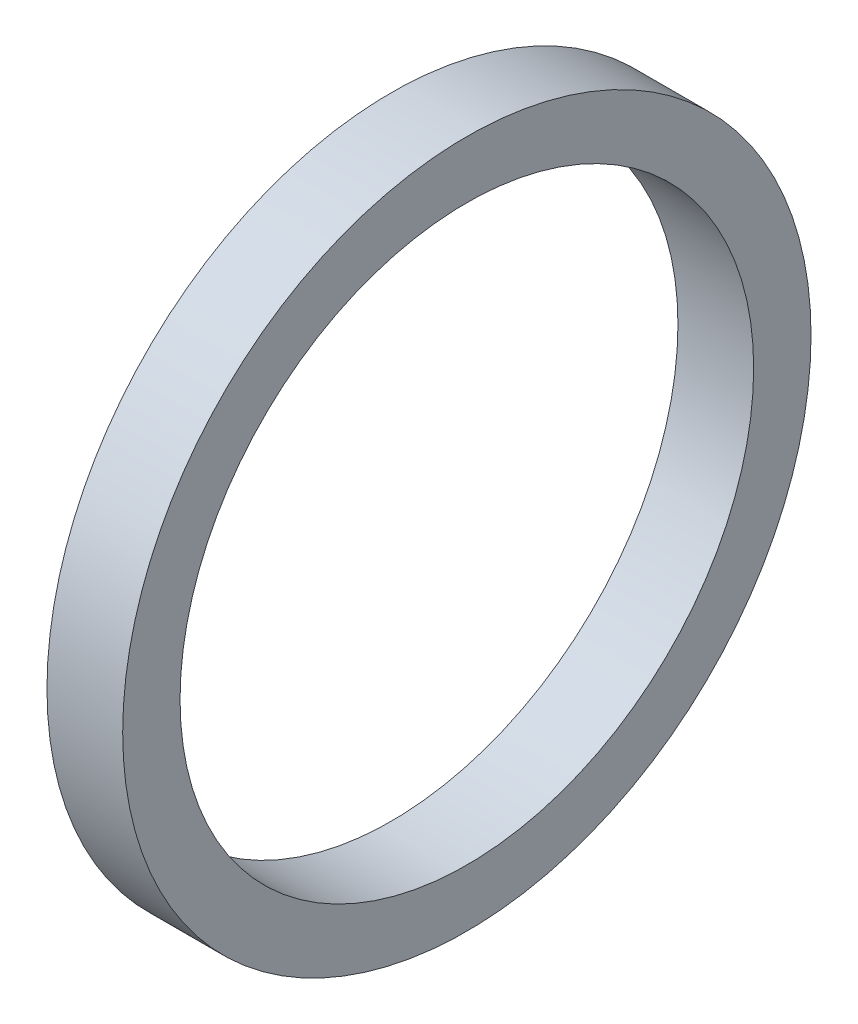
ISO-10303-21;
HEADER;
FILE_DESCRIPTION(('STEP AP214'),'2;1');
FILE_NAME('part.step','',(''),(''),'','','');
FILE_SCHEMA(('AUTOMOTIVE_DESIGN { 1 0 10303 214 1 1 1 1 }'));
ENDSEC;
DATA;
#1=APPLICATION_CONTEXT('core data for automotive mechanical design processes');
#2=APPLICATION_PROTOCOL_DEFINITION('international standard','automotive_design',2000,#1);
#3=PRODUCT_CONTEXT('',#1,'mechanical');
#4=PRODUCT('Part','Part','',(#3));
#5=PRODUCT_RELATED_PRODUCT_CATEGORY('part','',(#4));
#6=PRODUCT_DEFINITION_FORMATION('','',#4);
#7=PRODUCT_DEFINITION_CONTEXT('part definition',#1,'design');
#8=PRODUCT_DEFINITION('design','',#6,#7);
#9=PRODUCT_DEFINITION_SHAPE('','',#8);
#10=(LENGTH_UNIT() NAMED_UNIT(*) SI_UNIT(.MILLI.,.METRE.));
#11=(NAMED_UNIT(*) PLANE_ANGLE_UNIT() SI_UNIT($,.RADIAN.));
#12=(NAMED_UNIT(*) SI_UNIT($,.STERADIAN.) SOLID_ANGLE_UNIT());
#13=UNCERTAINTY_MEASURE_WITH_UNIT(LENGTH_MEASURE(1.E-05),#10,'distance_accuracy_value','');
#14=(GEOMETRIC_REPRESENTATION_CONTEXT(3) GLOBAL_UNCERTAINTY_ASSIGNED_CONTEXT((#13)) GLOBAL_UNIT_ASSIGNED_CONTEXT((#10,
#11,#12)) REPRESENTATION_CONTEXT('',''));
#15=CARTESIAN_POINT('',(0.,0.,0.));
#16=DIRECTION('',(0.,0.,1.));
#17=DIRECTION('',(1.,0.,0.));
#18=AXIS2_PLACEMENT_3D('',#15,#16,#17);
#19=CARTESIAN_POINT('',(2.0955,0.,0.));
#20=DIRECTION('',(1.,0.,0.));
#21=DIRECTION('',(0.,0.,-1.));
#22=AXIS2_PLACEMENT_3D('',#19,#20,#21);
#23=PLANE('',#22);
#24=CARTESIAN_POINT('',(2.0955,0.,0.));
#25=DIRECTION('',(1.,0.,0.));
#26=DIRECTION('',(0.,0.,-1.));
#27=AXIS2_PLACEMENT_3D('',#24,#25,#26);
#28=CIRCLE('',#27,9.525);
#29=CARTESIAN_POINT('',(2.0955,0.,-9.525));
#30=VERTEX_POINT('',#29);
#31=EDGE_CURVE('E10',#30,#30,#28,.T.);
#32=ORIENTED_EDGE('',*,*,#31,.T.);
#33=EDGE_LOOP('',(#32));
#34=FACE_BOUND('',#33,.T.);
#35=CARTESIAN_POINT('',(2.0955,0.,0.));
#36=DIRECTION('',(1.,0.,0.));
#37=DIRECTION('',(0.,0.,-1.));
#38=AXIS2_PLACEMENT_3D('',#35,#36,#37);
#39=CIRCLE('',#38,7.9375);
#40=CARTESIAN_POINT('',(2.0955,0.,-7.9375));
#41=VERTEX_POINT('',#40);
#42=EDGE_CURVE('E43',#41,#41,#39,.T.);
#43=ORIENTED_EDGE('',*,*,#42,.F.);
#44=EDGE_LOOP('',(#43));
#45=FACE_BOUND('',#44,.T.);
#46=ADVANCED_FACE('F32',(#34,#45),#23,.T.);
#47=CARTESIAN_POINT('',(0.,0.,0.));
#48=DIRECTION('',(1.,0.,0.));
#49=DIRECTION('',(0.,0.,-1.));
#50=AXIS2_PLACEMENT_3D('',#47,#48,#49);
#51=PLANE('',#50);
#52=CARTESIAN_POINT('',(0.,0.,0.));
#53=DIRECTION('',(1.,0.,0.));
#54=DIRECTION('',(0.,0.,-1.));
#55=AXIS2_PLACEMENT_3D('',#52,#53,#54);
#56=CIRCLE('',#55,9.525);
#57=CARTESIAN_POINT('',(0.,0.,-9.525));
#58=VERTEX_POINT('',#57);
#59=EDGE_CURVE('E36',#58,#58,#56,.T.);
#60=ORIENTED_EDGE('',*,*,#59,.F.);
#61=EDGE_LOOP('',(#60));
#62=FACE_BOUND('',#61,.T.);
#63=CARTESIAN_POINT('',(0.,0.,0.));
#64=DIRECTION('',(1.,0.,0.));
#65=DIRECTION('',(0.,0.,-1.));
#66=AXIS2_PLACEMENT_3D('',#63,#64,#65);
#67=CIRCLE('',#66,7.9375);
#68=CARTESIAN_POINT('',(0.,0.,-7.9375));
#69=VERTEX_POINT('',#68);
#70=EDGE_CURVE('E45',#69,#69,#67,.T.);
#71=ORIENTED_EDGE('',*,*,#70,.T.);
#72=EDGE_LOOP('',(#71));
#73=FACE_BOUND('',#72,.T.);
#74=ADVANCED_FACE('F55',(#62,#73),#51,.F.);
#75=CARTESIAN_POINT('',(2.0955,0.,0.));
#76=DIRECTION('',(-1.,0.,0.));
#77=DIRECTION('',(0.,0.,1.));
#78=AXIS2_PLACEMENT_3D('',#75,#76,#77);
#79=CYLINDRICAL_SURFACE('',#78,9.525);
#80=ORIENTED_EDGE('',*,*,#31,.F.);
#81=EDGE_LOOP('',(#80));
#82=FACE_BOUND('',#81,.T.);
#83=ORIENTED_EDGE('',*,*,#59,.T.);
#84=EDGE_LOOP('',(#83));
#85=FACE_BOUND('',#84,.T.);
#86=ADVANCED_FACE('F34',(#82,#85),#79,.T.);
#87=CARTESIAN_POINT('',(2.0955,0.,0.));
#88=DIRECTION('',(-1.,0.,0.));
#89=DIRECTION('',(0.,0.,1.));
#90=AXIS2_PLACEMENT_3D('',#87,#88,#89);
#91=CYLINDRICAL_SURFACE('',#90,7.9375);
#92=ORIENTED_EDGE('',*,*,#42,.T.);
#93=EDGE_LOOP('',(#92));
#94=FACE_BOUND('',#93,.T.);
#95=ORIENTED_EDGE('',*,*,#70,.F.);
#96=EDGE_LOOP('',(#95));
#97=FACE_BOUND('',#96,.T.);
#98=ADVANCED_FACE('F51',(#94,#97),#91,.F.);
#99=CLOSED_SHELL('',(#46,#74,#86,#98));
#100=MANIFOLD_SOLID_BREP('B2',#99);
#101=ADVANCED_BREP_SHAPE_REPRESENTATION('',(#18,#100),#14);
#102=SHAPE_DEFINITION_REPRESENTATION(#9,#101);
ENDSEC;
END-ISO-10303-21;
